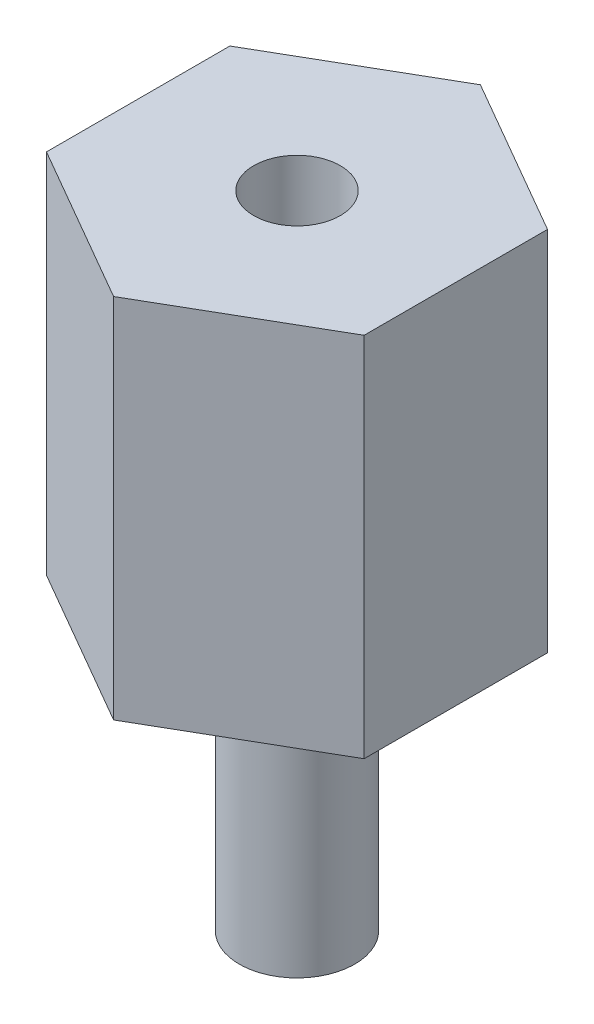
ISO-10303-21;
HEADER;
FILE_DESCRIPTION(('STEP AP214'),'2;1');
FILE_NAME('part.step','',(''),(''),'','','');
FILE_SCHEMA(('AUTOMOTIVE_DESIGN { 1 0 10303 214 1 1 1 1 }'));
ENDSEC;
DATA;
#1=APPLICATION_CONTEXT('core data for automotive mechanical design processes');
#2=APPLICATION_PROTOCOL_DEFINITION('international standard','automotive_design',2000,#1);
#3=PRODUCT_CONTEXT('',#1,'mechanical');
#4=PRODUCT('Part','Part','',(#3));
#5=PRODUCT_RELATED_PRODUCT_CATEGORY('part','',(#4));
#6=PRODUCT_DEFINITION_FORMATION('','',#4);
#7=PRODUCT_DEFINITION_CONTEXT('part definition',#1,'design');
#8=PRODUCT_DEFINITION('design','',#6,#7);
#9=PRODUCT_DEFINITION_SHAPE('','',#8);
#10=(LENGTH_UNIT() NAMED_UNIT(*) SI_UNIT(.MILLI.,.METRE.));
#11=(NAMED_UNIT(*) PLANE_ANGLE_UNIT() SI_UNIT($,.RADIAN.));
#12=(NAMED_UNIT(*) SI_UNIT($,.STERADIAN.) SOLID_ANGLE_UNIT());
#13=UNCERTAINTY_MEASURE_WITH_UNIT(LENGTH_MEASURE(1.E-05),#10,'distance_accuracy_value','');
#14=(GEOMETRIC_REPRESENTATION_CONTEXT(3) GLOBAL_UNCERTAINTY_ASSIGNED_CONTEXT((#13)) GLOBAL_UNIT_ASSIGNED_CONTEXT((#10,
#11,#12)) REPRESENTATION_CONTEXT('',''));
#15=CARTESIAN_POINT('',(0.,0.,0.));
#16=DIRECTION('',(0.,0.,1.));
#17=DIRECTION('',(1.,0.,0.));
#18=AXIS2_PLACEMENT_3D('',#15,#16,#17);
#19=CARTESIAN_POINT('',(5.49999999999997,12.7,-3.17542648054301));
#20=DIRECTION('',(-0.499999999999995,0.,0.866025403784441));
#21=DIRECTION('',(0.866025403784442,0.,0.499999999999995));
#22=AXIS2_PLACEMENT_3D('',#19,#20,#21);
#23=PLANE('',#22);
#24=DIRECTION('',(-0.866025403784442,0.,-0.499999999999995));
#25=VECTOR('',#24,1.);
#26=CARTESIAN_POINT('',(5.49999999999997,0.,-3.17542648054301));
#27=LINE('',#26,#25);
#28=CARTESIAN_POINT('',(5.49999999999997,0.,-3.17542648054301));
#29=VERTEX_POINT('',#28);
#30=CARTESIAN_POINT('',(0.,0.,-6.35085296108589));
#31=VERTEX_POINT('',#30);
#32=EDGE_CURVE('E119',#29,#31,#27,.T.);
#33=ORIENTED_EDGE('',*,*,#32,.T.);
#34=DIRECTION('',(0.,-1.,0.));
#35=VECTOR('',#34,1.);
#36=CARTESIAN_POINT('',(0.,12.7,-6.35085296108589));
#37=LINE('',#36,#35);
#38=CARTESIAN_POINT('',(0.,12.7,-6.35085296108589));
#39=VERTEX_POINT('',#38);
#40=EDGE_CURVE('E36',#39,#31,#37,.T.);
#41=ORIENTED_EDGE('',*,*,#40,.F.);
#42=DIRECTION('',(-0.866025403784442,0.,-0.499999999999995));
#43=VECTOR('',#42,1.);
#44=CARTESIAN_POINT('',(5.49999999999997,12.7,-3.17542648054301));
#45=LINE('',#44,#43);
#46=CARTESIAN_POINT('',(5.49999999999997,12.7,-3.17542648054301));
#47=VERTEX_POINT('',#46);
#48=EDGE_CURVE('E130',#47,#39,#45,.T.);
#49=ORIENTED_EDGE('',*,*,#48,.F.);
#50=DIRECTION('',(0.,-1.,0.));
#51=VECTOR('',#50,1.);
#52=CARTESIAN_POINT('',(5.49999999999997,12.7,-3.17542648054301));
#53=LINE('',#52,#51);
#54=EDGE_CURVE('E115',#47,#29,#53,.T.);
#55=ORIENTED_EDGE('',*,*,#54,.T.);
#56=EDGE_LOOP('',(#33,#41,#49,#55));
#57=FACE_BOUND('',#56,.T.);
#58=ADVANCED_FACE('F33',(#57),#23,.F.);
#59=CARTESIAN_POINT('',(0.,12.7,-6.35085296108589));
#60=DIRECTION('',(0.500000000000001,0.,0.866025403784438));
#61=DIRECTION('',(0.866025403784438,0.,-0.500000000000001));
#62=AXIS2_PLACEMENT_3D('',#59,#60,#61);
#63=PLANE('',#62);
#64=DIRECTION('',(-0.866025403784438,0.,0.500000000000001));
#65=VECTOR('',#64,1.);
#66=CARTESIAN_POINT('',(0.,0.,-6.35085296108589));
#67=LINE('',#66,#65);
#68=CARTESIAN_POINT('',(-5.50000000000001,0.,-3.17542648054293));
#69=VERTEX_POINT('',#68);
#70=EDGE_CURVE('E122',#31,#69,#67,.T.);
#71=ORIENTED_EDGE('',*,*,#70,.T.);
#72=DIRECTION('',(0.,-1.,0.));
#73=VECTOR('',#72,1.);
#74=CARTESIAN_POINT('',(-5.50000000000001,12.7,-3.17542648054293));
#75=LINE('',#74,#73);
#76=CARTESIAN_POINT('',(-5.50000000000001,12.7,-3.17542648054293));
#77=VERTEX_POINT('',#76);
#78=EDGE_CURVE('E133',#77,#69,#75,.T.);
#79=ORIENTED_EDGE('',*,*,#78,.F.);
#80=DIRECTION('',(-0.866025403784438,0.,0.500000000000001));
#81=VECTOR('',#80,1.);
#82=CARTESIAN_POINT('',(0.,12.7,-6.35085296108589));
#83=LINE('',#82,#81);
#84=EDGE_CURVE('E88',#39,#77,#83,.T.);
#85=ORIENTED_EDGE('',*,*,#84,.F.);
#86=ORIENTED_EDGE('',*,*,#40,.T.);
#87=EDGE_LOOP('',(#71,#79,#85,#86));
#88=FACE_BOUND('',#87,.T.);
#89=ADVANCED_FACE('F138',(#88),#63,.F.);
#90=CARTESIAN_POINT('',(-5.50000000000001,12.7,-3.17542648054293));
#91=DIRECTION('',(1.,0.,0.));
#92=DIRECTION('',(0.,0.,-1.));
#93=AXIS2_PLACEMENT_3D('',#90,#91,#92);
#94=PLANE('',#93);
#95=DIRECTION('',(0.,0.,1.));
#96=VECTOR('',#95,1.);
#97=CARTESIAN_POINT('',(-5.50000000000001,0.,-3.17542648054293));
#98=LINE('',#97,#96);
#99=CARTESIAN_POINT('',(-5.49999999999999,0.,3.17542648054297));
#100=VERTEX_POINT('',#99);
#101=EDGE_CURVE('E125',#69,#100,#98,.T.);
#102=ORIENTED_EDGE('',*,*,#101,.T.);
#103=DIRECTION('',(0.,-1.,0.));
#104=VECTOR('',#103,1.);
#105=CARTESIAN_POINT('',(-5.49999999999999,12.7,3.17542648054297));
#106=LINE('',#105,#104);
#107=CARTESIAN_POINT('',(-5.49999999999999,12.7,3.17542648054297));
#108=VERTEX_POINT('',#107);
#109=EDGE_CURVE('E110',#108,#100,#106,.T.);
#110=ORIENTED_EDGE('',*,*,#109,.F.);
#111=DIRECTION('',(0.,0.,1.));
#112=VECTOR('',#111,1.);
#113=CARTESIAN_POINT('',(-5.50000000000001,12.7,-3.17542648054293));
#114=LINE('',#113,#112);
#115=EDGE_CURVE('E101',#77,#108,#114,.T.);
#116=ORIENTED_EDGE('',*,*,#115,.F.);
#117=ORIENTED_EDGE('',*,*,#78,.T.);
#118=EDGE_LOOP('',(#102,#110,#116,#117));
#119=FACE_BOUND('',#118,.T.);
#120=ADVANCED_FACE('F144',(#119),#94,.F.);
#121=CARTESIAN_POINT('',(-5.49999999999999,12.7,3.17542648054297));
#122=DIRECTION('',(0.499999999999995,0.,-0.866025403784442));
#123=DIRECTION('',(-0.866025403784442,0.,-0.499999999999995));
#124=AXIS2_PLACEMENT_3D('',#121,#122,#123);
#125=PLANE('',#124);
#126=DIRECTION('',(0.866025403784442,0.,0.499999999999995));
#127=VECTOR('',#126,1.);
#128=CARTESIAN_POINT('',(-5.49999999999999,0.,3.17542648054297));
#129=LINE('',#128,#127);
#130=CARTESIAN_POINT('',(0.,0.,6.35085296108589));
#131=VERTEX_POINT('',#130);
#132=EDGE_CURVE('E109',#100,#131,#129,.T.);
#133=ORIENTED_EDGE('',*,*,#132,.T.);
#134=DIRECTION('',(0.,-1.,0.));
#135=VECTOR('',#134,1.);
#136=CARTESIAN_POINT('',(0.,12.7,6.35085296108589));
#137=LINE('',#136,#135);
#138=CARTESIAN_POINT('',(0.,12.7,6.35085296108589));
#139=VERTEX_POINT('',#138);
#140=EDGE_CURVE('E106',#139,#131,#137,.T.);
#141=ORIENTED_EDGE('',*,*,#140,.F.);
#142=DIRECTION('',(0.866025403784442,0.,0.499999999999995));
#143=VECTOR('',#142,1.);
#144=CARTESIAN_POINT('',(-5.49999999999999,12.7,3.17542648054297));
#145=LINE('',#144,#143);
#146=EDGE_CURVE('E95',#108,#139,#145,.T.);
#147=ORIENTED_EDGE('',*,*,#146,.F.);
#148=ORIENTED_EDGE('',*,*,#109,.T.);
#149=EDGE_LOOP('',(#133,#141,#147,#148));
#150=FACE_BOUND('',#149,.T.);
#151=ADVANCED_FACE('F107',(#150),#125,.F.);
#152=CARTESIAN_POINT('',(0.,12.7,6.35085296108589));
#153=DIRECTION('',(-0.500000000000007,0.,-0.866025403784435));
#154=DIRECTION('',(-0.866025403784435,0.,0.500000000000007));
#155=AXIS2_PLACEMENT_3D('',#152,#153,#154);
#156=PLANE('',#155);
#157=DIRECTION('',(0.866025403784435,0.,-0.500000000000007));
#158=VECTOR('',#157,1.);
#159=CARTESIAN_POINT('',(0.,0.,6.35085296108589));
#160=LINE('',#159,#158);
#161=CARTESIAN_POINT('',(5.50000000000003,0.,3.17542648054289));
#162=VERTEX_POINT('',#161);
#163=EDGE_CURVE('E73',#131,#162,#160,.T.);
#164=ORIENTED_EDGE('',*,*,#163,.T.);
#165=DIRECTION('',(0.,-1.,0.));
#166=VECTOR('',#165,1.);
#167=CARTESIAN_POINT('',(5.50000000000003,12.7,3.17542648054289));
#168=LINE('',#167,#166);
#169=CARTESIAN_POINT('',(5.50000000000003,12.7,3.17542648054289));
#170=VERTEX_POINT('',#169);
#171=EDGE_CURVE('E111',#170,#162,#168,.T.);
#172=ORIENTED_EDGE('',*,*,#171,.F.);
#173=DIRECTION('',(0.866025403784435,0.,-0.500000000000007));
#174=VECTOR('',#173,1.);
#175=CARTESIAN_POINT('',(0.,12.7,6.35085296108589));
#176=LINE('',#175,#174);
#177=EDGE_CURVE('E99',#139,#170,#176,.T.);
#178=ORIENTED_EDGE('',*,*,#177,.F.);
#179=ORIENTED_EDGE('',*,*,#140,.T.);
#180=EDGE_LOOP('',(#164,#172,#178,#179));
#181=FACE_BOUND('',#180,.T.);
#182=ADVANCED_FACE('F113',(#181),#156,.F.);
#183=CARTESIAN_POINT('',(5.50000000000003,12.7,3.17542648054289));
#184=DIRECTION('',(-1.,0.,0.));
#185=DIRECTION('',(0.,0.,1.));
#186=AXIS2_PLACEMENT_3D('',#183,#184,#185);
#187=PLANE('',#186);
#188=DIRECTION('',(0.,0.,-1.));
#189=VECTOR('',#188,1.);
#190=CARTESIAN_POINT('',(5.50000000000003,0.,3.17542648054289));
#191=LINE('',#190,#189);
#192=EDGE_CURVE('E79',#162,#29,#191,.T.);
#193=ORIENTED_EDGE('',*,*,#192,.T.);
#194=ORIENTED_EDGE('',*,*,#54,.F.);
#195=DIRECTION('',(0.,0.,-1.));
#196=VECTOR('',#195,1.);
#197=CARTESIAN_POINT('',(5.50000000000003,12.7,3.17542648054289));
#198=LINE('',#197,#196);
#199=EDGE_CURVE('E50',#170,#47,#198,.T.);
#200=ORIENTED_EDGE('',*,*,#199,.F.);
#201=ORIENTED_EDGE('',*,*,#171,.T.);
#202=EDGE_LOOP('',(#193,#194,#200,#201));
#203=FACE_BOUND('',#202,.T.);
#204=ADVANCED_FACE('F175',(#203),#187,.F.);
#205=CARTESIAN_POINT('',(0.,12.7,0.));
#206=DIRECTION('',(0.,1.,0.));
#207=DIRECTION('',(0.,0.,1.));
#208=AXIS2_PLACEMENT_3D('',#205,#206,#207);
#209=PLANE('',#208);
#210=CARTESIAN_POINT('',(0.,12.7,0.));
#211=DIRECTION('',(0.,1.,0.));
#212=DIRECTION('',(0.,0.,1.));
#213=AXIS2_PLACEMENT_3D('',#210,#211,#212);
#214=CIRCLE('',#213,1.5);
#215=CARTESIAN_POINT('',(0.,12.7,1.5));
#216=VERTEX_POINT('',#215);
#217=EDGE_CURVE('E148',#216,#216,#214,.T.);
#218=ORIENTED_EDGE('',*,*,#217,.F.);
#219=EDGE_LOOP('',(#218));
#220=FACE_BOUND('',#219,.T.);
#221=ORIENTED_EDGE('',*,*,#48,.T.);
#222=ORIENTED_EDGE('',*,*,#84,.T.);
#223=ORIENTED_EDGE('',*,*,#115,.T.);
#224=ORIENTED_EDGE('',*,*,#146,.T.);
#225=ORIENTED_EDGE('',*,*,#177,.T.);
#226=ORIENTED_EDGE('',*,*,#199,.T.);
#227=EDGE_LOOP('',(#221,#222,#223,#224,#225,#226));
#228=FACE_BOUND('',#227,.T.);
#229=ADVANCED_FACE('F97',(#220,#228),#209,.T.);
#230=CARTESIAN_POINT('',(0.,0.,0.));
#231=DIRECTION('',(0.,1.,0.));
#232=DIRECTION('',(0.,0.,1.));
#233=AXIS2_PLACEMENT_3D('',#230,#231,#232);
#234=PLANE('',#233);
#235=CARTESIAN_POINT('',(0.,0.,0.));
#236=DIRECTION('',(0.,-1.,0.));
#237=DIRECTION('',(0.,0.,-1.));
#238=AXIS2_PLACEMENT_3D('',#235,#236,#237);
#239=CIRCLE('',#238,2.);
#240=CARTESIAN_POINT('',(0.,0.,-2.));
#241=VERTEX_POINT('',#240);
#242=EDGE_CURVE('E11',#241,#241,#239,.T.);
#243=ORIENTED_EDGE('',*,*,#242,.F.);
#244=EDGE_LOOP('',(#243));
#245=FACE_BOUND('',#244,.T.);
#246=ORIENTED_EDGE('',*,*,#32,.F.);
#247=ORIENTED_EDGE('',*,*,#192,.F.);
#248=ORIENTED_EDGE('',*,*,#163,.F.);
#249=ORIENTED_EDGE('',*,*,#132,.F.);
#250=ORIENTED_EDGE('',*,*,#101,.F.);
#251=ORIENTED_EDGE('',*,*,#70,.F.);
#252=EDGE_LOOP('',(#246,#247,#248,#249,#250,#251));
#253=FACE_BOUND('',#252,.T.);
#254=ADVANCED_FACE('F143',(#245,#253),#234,.F.);
#255=CARTESIAN_POINT('',(0.,9.5,0.));
#256=DIRECTION('',(0.,1.,0.));
#257=DIRECTION('',(0.,0.,1.));
#258=AXIS2_PLACEMENT_3D('',#255,#256,#257);
#259=CYLINDRICAL_SURFACE('',#258,1.5);
#260=CARTESIAN_POINT('',(0.,9.5,0.));
#261=DIRECTION('',(0.,1.,0.));
#262=DIRECTION('',(0.,0.,1.));
#263=AXIS2_PLACEMENT_3D('',#260,#261,#262);
#264=CIRCLE('',#263,1.5);
#265=CARTESIAN_POINT('',(0.,9.5,1.5));
#266=VERTEX_POINT('',#265);
#267=EDGE_CURVE('E123',#266,#266,#264,.T.);
#268=ORIENTED_EDGE('',*,*,#267,.F.);
#269=EDGE_LOOP('',(#268));
#270=FACE_BOUND('',#269,.T.);
#271=ORIENTED_EDGE('',*,*,#217,.T.);
#272=EDGE_LOOP('',(#271));
#273=FACE_BOUND('',#272,.T.);
#274=ADVANCED_FACE('F167',(#270,#273),#259,.F.);
#275=CARTESIAN_POINT('',(0.,9.5,0.));
#276=DIRECTION('',(0.,1.,0.));
#277=DIRECTION('',(0.,0.,1.));
#278=AXIS2_PLACEMENT_3D('',#275,#276,#277);
#279=PLANE('',#278);
#280=ORIENTED_EDGE('',*,*,#267,.T.);
#281=EDGE_LOOP('',(#280));
#282=FACE_BOUND('',#281,.T.);
#283=ADVANCED_FACE('F162',(#282),#279,.T.);
#284=CARTESIAN_POINT('',(0.,-9.5,0.));
#285=DIRECTION('',(0.,1.,0.));
#286=DIRECTION('',(0.,0.,1.));
#287=AXIS2_PLACEMENT_3D('',#284,#285,#286);
#288=CYLINDRICAL_SURFACE('',#287,2.);
#289=CARTESIAN_POINT('',(0.,-9.5,0.));
#290=DIRECTION('',(0.,-1.,0.));
#291=DIRECTION('',(0.,0.,-1.));
#292=AXIS2_PLACEMENT_3D('',#289,#290,#291);
#293=CIRCLE('',#292,2.);
#294=CARTESIAN_POINT('',(0.,-9.5,-2.));
#295=VERTEX_POINT('',#294);
#296=EDGE_CURVE('E151',#295,#295,#293,.T.);
#297=ORIENTED_EDGE('',*,*,#296,.F.);
#298=EDGE_LOOP('',(#297));
#299=FACE_BOUND('',#298,.T.);
#300=ORIENTED_EDGE('',*,*,#242,.T.);
#301=EDGE_LOOP('',(#300));
#302=FACE_BOUND('',#301,.T.);
#303=ADVANCED_FACE('F159',(#299,#302),#288,.T.);
#304=CARTESIAN_POINT('',(0.,-9.5,0.));
#305=DIRECTION('',(0.,-1.,0.));
#306=DIRECTION('',(0.,0.,-1.));
#307=AXIS2_PLACEMENT_3D('',#304,#305,#306);
#308=PLANE('',#307);
#309=ORIENTED_EDGE('',*,*,#296,.T.);
#310=EDGE_LOOP('',(#309));
#311=FACE_BOUND('',#310,.T.);
#312=ADVANCED_FACE('F157',(#311),#308,.T.);
#313=CLOSED_SHELL('',(#58,#89,#120,#151,#182,#204,#229,#254,#274,#283,#303,#312));
#314=MANIFOLD_SOLID_BREP('B2',#313);
#315=ADVANCED_BREP_SHAPE_REPRESENTATION('',(#18,#314),#14);
#316=SHAPE_DEFINITION_REPRESENTATION(#9,#315);
ENDSEC;
END-ISO-10303-21;
